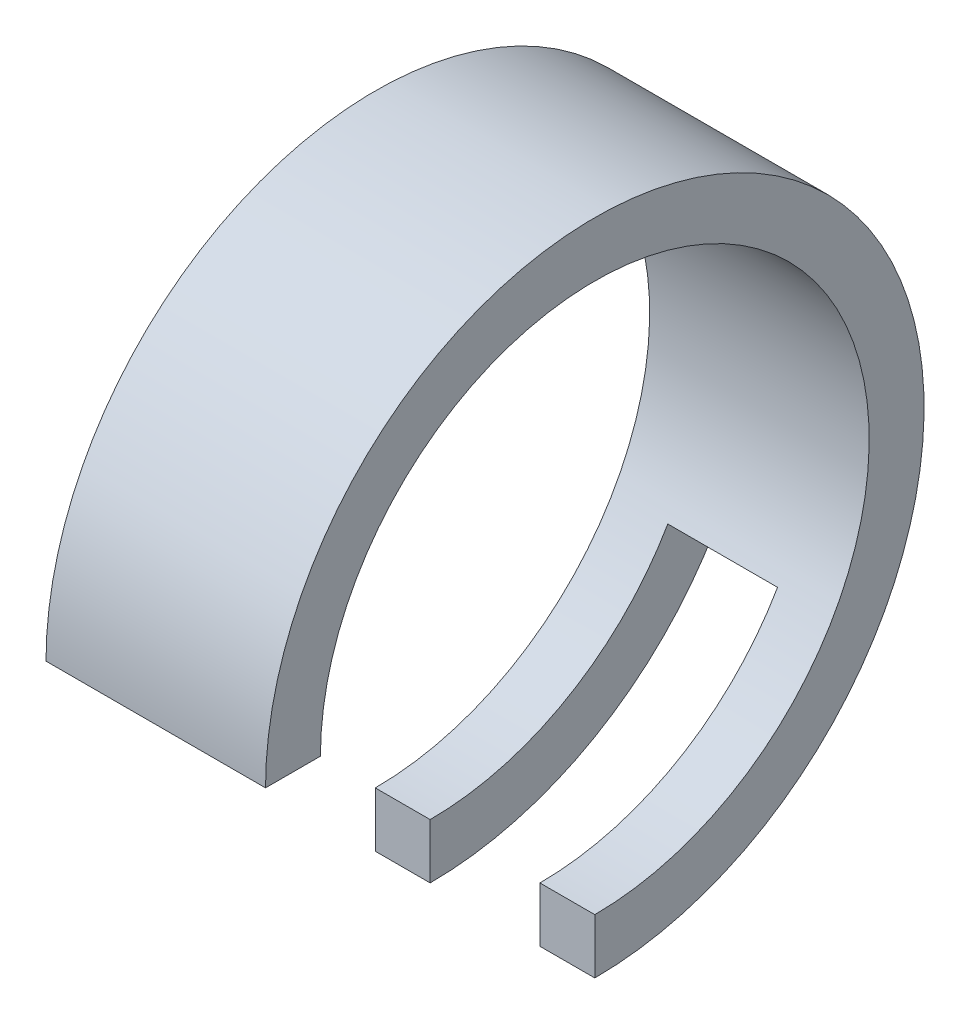
ISO-10303-21;
HEADER;
FILE_DESCRIPTION(('STEP AP214'),'2;1');
FILE_NAME('part.step','',(''),(''),'','','');
FILE_SCHEMA(('AUTOMOTIVE_DESIGN { 1 0 10303 214 1 1 1 1 }'));
ENDSEC;
DATA;
#1=APPLICATION_CONTEXT('core data for automotive mechanical design processes');
#2=APPLICATION_PROTOCOL_DEFINITION('international standard','automotive_design',2000,#1);
#3=PRODUCT_CONTEXT('',#1,'mechanical');
#4=PRODUCT('Part','Part','',(#3));
#5=PRODUCT_RELATED_PRODUCT_CATEGORY('part','',(#4));
#6=PRODUCT_DEFINITION_FORMATION('','',#4);
#7=PRODUCT_DEFINITION_CONTEXT('part definition',#1,'design');
#8=PRODUCT_DEFINITION('design','',#6,#7);
#9=PRODUCT_DEFINITION_SHAPE('','',#8);
#10=(LENGTH_UNIT() NAMED_UNIT(*) SI_UNIT(.MILLI.,.METRE.));
#11=(NAMED_UNIT(*) PLANE_ANGLE_UNIT() SI_UNIT($,.RADIAN.));
#12=(NAMED_UNIT(*) SI_UNIT($,.STERADIAN.) SOLID_ANGLE_UNIT());
#13=UNCERTAINTY_MEASURE_WITH_UNIT(LENGTH_MEASURE(1.E-05),#10,'distance_accuracy_value','');
#14=(GEOMETRIC_REPRESENTATION_CONTEXT(3) GLOBAL_UNCERTAINTY_ASSIGNED_CONTEXT((#13)) GLOBAL_UNIT_ASSIGNED_CONTEXT((#10,
#11,#12)) REPRESENTATION_CONTEXT('',''));
#15=CARTESIAN_POINT('',(0.,0.,0.));
#16=DIRECTION('',(0.,0.,1.));
#17=DIRECTION('',(1.,0.,0.));
#18=AXIS2_PLACEMENT_3D('',#15,#16,#17);
#19=CARTESIAN_POINT('',(-365.597578267393,25.,0.));
#20=DIRECTION('',(-1.,0.,0.));
#21=DIRECTION('',(0.,0.,1.));
#22=AXIS2_PLACEMENT_3D('',#19,#20,#21);
#23=CYLINDRICAL_SURFACE('',#22,25.);
#24=DIRECTION('',(-1.,0.,0.));
#25=VECTOR('',#24,1.);
#26=CARTESIAN_POINT('',(0.,12.5,-21.6506350946109));
#27=LINE('',#26,#25);
#28=CARTESIAN_POINT('',(15.,12.5,-21.6506350946109));
#29=VERTEX_POINT('',#28);
#30=CARTESIAN_POINT('',(4.99999999999999,12.5,-21.6506350946109));
#31=VERTEX_POINT('',#30);
#32=EDGE_CURVE('E123',#29,#31,#27,.T.);
#33=ORIENTED_EDGE('',*,*,#32,.F.);
#34=CARTESIAN_POINT('',(15.,25.,0.));
#35=DIRECTION('',(-1.,0.,0.));
#36=DIRECTION('',(0.,0.,1.));
#37=AXIS2_PLACEMENT_3D('',#34,#35,#36);
#38=CIRCLE('',#37,25.);
#39=CARTESIAN_POINT('',(15.,0.,0.));
#40=VERTEX_POINT('',#39);
#41=EDGE_CURVE('E109',#29,#40,#38,.T.);
#42=ORIENTED_EDGE('',*,*,#41,.T.);
#43=DIRECTION('',(-1.,0.,0.));
#44=VECTOR('',#43,1.);
#45=CARTESIAN_POINT('',(0.,0.,0.));
#46=LINE('',#45,#44);
#47=CARTESIAN_POINT('',(20.,0.,0.));
#48=VERTEX_POINT('',#47);
#49=EDGE_CURVE('E121',#48,#40,#46,.T.);
#50=ORIENTED_EDGE('',*,*,#49,.F.);
#51=CARTESIAN_POINT('',(20.,25.,0.));
#52=DIRECTION('',(-1.,0.,0.));
#53=DIRECTION('',(0.,0.,1.));
#54=AXIS2_PLACEMENT_3D('',#51,#52,#53);
#55=CIRCLE('',#54,25.);
#56=CARTESIAN_POINT('',(20.,24.9999999999997,25.));
#57=VERTEX_POINT('',#56);
#58=EDGE_CURVE('E48',#57,#48,#55,.T.);
#59=ORIENTED_EDGE('',*,*,#58,.F.);
#60=DIRECTION('',(-1.,0.,0.));
#61=VECTOR('',#60,1.);
#62=CARTESIAN_POINT('',(0.,24.9999999999997,25.));
#63=LINE('',#62,#61);
#64=CARTESIAN_POINT('',(0.,24.9999999999997,25.));
#65=VERTEX_POINT('',#64);
#66=EDGE_CURVE('E144',#57,#65,#63,.T.);
#67=ORIENTED_EDGE('',*,*,#66,.T.);
#68=CARTESIAN_POINT('',(0.,25.,0.));
#69=DIRECTION('',(-1.,0.,0.));
#70=DIRECTION('',(0.,0.,1.));
#71=AXIS2_PLACEMENT_3D('',#68,#69,#70);
#72=CIRCLE('',#71,25.);
#73=CARTESIAN_POINT('',(0.,0.,0.));
#74=VERTEX_POINT('',#73);
#75=EDGE_CURVE('E151',#65,#74,#72,.T.);
#76=ORIENTED_EDGE('',*,*,#75,.T.);
#77=CARTESIAN_POINT('',(4.99999999999999,0.,0.));
#78=VERTEX_POINT('',#77);
#79=EDGE_CURVE('E132',#78,#74,#46,.T.);
#80=ORIENTED_EDGE('',*,*,#79,.F.);
#81=CARTESIAN_POINT('',(5.,25.,0.));
#82=DIRECTION('',(-1.,0.,0.));
#83=DIRECTION('',(0.,0.,1.));
#84=AXIS2_PLACEMENT_3D('',#81,#82,#83);
#85=CIRCLE('',#84,25.);
#86=EDGE_CURVE('E125',#31,#78,#85,.T.);
#87=ORIENTED_EDGE('',*,*,#86,.F.);
#88=EDGE_LOOP('',(#33,#42,#50,#59,#67,#76,#80,#87));
#89=FACE_BOUND('',#88,.T.);
#90=ADVANCED_FACE('F40',(#89),#23,.F.);
#91=CARTESIAN_POINT('',(0.,0.,0.));
#92=DIRECTION('',(0.,0.,1.));
#93=DIRECTION('',(1.,0.,0.));
#94=AXIS2_PLACEMENT_3D('',#91,#92,#93);
#95=PLANE('',#94);
#96=ORIENTED_EDGE('',*,*,#49,.T.);
#97=DIRECTION('',(0.,-1.,0.));
#98=VECTOR('',#97,1.);
#99=CARTESIAN_POINT('',(15.,0.,0.));
#100=LINE('',#99,#98);
#101=CARTESIAN_POINT('',(15.,-4.99999999999999,0.));
#102=VERTEX_POINT('',#101);
#103=EDGE_CURVE('E106',#40,#102,#100,.T.);
#104=ORIENTED_EDGE('',*,*,#103,.T.);
#105=DIRECTION('',(1.,0.,0.));
#106=VECTOR('',#105,1.);
#107=CARTESIAN_POINT('',(0.,-4.99999999999999,0.));
#108=LINE('',#107,#106);
#109=CARTESIAN_POINT('',(20.,-4.99999999999999,0.));
#110=VERTEX_POINT('',#109);
#111=EDGE_CURVE('E124',#102,#110,#108,.T.);
#112=ORIENTED_EDGE('',*,*,#111,.T.);
#113=DIRECTION('',(0.,1.,0.));
#114=VECTOR('',#113,1.);
#115=CARTESIAN_POINT('',(20.,0.,0.));
#116=LINE('',#115,#114);
#117=EDGE_CURVE('E130',#110,#48,#116,.T.);
#118=ORIENTED_EDGE('',*,*,#117,.T.);
#119=EDGE_LOOP('',(#96,#104,#112,#118));
#120=FACE_BOUND('',#119,.T.);
#121=ADVANCED_FACE('F128',(#120),#95,.T.);
#122=CARTESIAN_POINT('',(-365.597578267393,25.,0.));
#123=DIRECTION('',(-1.,0.,0.));
#124=DIRECTION('',(0.,0.,1.));
#125=AXIS2_PLACEMENT_3D('',#122,#123,#124);
#126=CYLINDRICAL_SURFACE('',#125,29.9999999999999);
#127=ORIENTED_EDGE('',*,*,#111,.F.);
#128=CARTESIAN_POINT('',(15.,25.,0.));
#129=DIRECTION('',(-1.,0.,0.));
#130=DIRECTION('',(0.,0.,1.));
#131=AXIS2_PLACEMENT_3D('',#128,#129,#130);
#132=CIRCLE('',#131,29.9999999999999);
#133=CARTESIAN_POINT('',(15.,10.,-25.9807621135331));
#134=VERTEX_POINT('',#133);
#135=EDGE_CURVE('E112',#134,#102,#132,.T.);
#136=ORIENTED_EDGE('',*,*,#135,.F.);
#137=DIRECTION('',(1.,0.,0.));
#138=VECTOR('',#137,1.);
#139=CARTESIAN_POINT('',(0.,10.,-25.9807621135331));
#140=LINE('',#139,#138);
#141=CARTESIAN_POINT('',(4.99999999999995,10.,-25.9807621135331));
#142=VERTEX_POINT('',#141);
#143=EDGE_CURVE('E315',#142,#134,#140,.T.);
#144=ORIENTED_EDGE('',*,*,#143,.F.);
#145=CARTESIAN_POINT('',(5.,25.,0.));
#146=DIRECTION('',(-1.,0.,0.));
#147=DIRECTION('',(0.,0.,1.));
#148=AXIS2_PLACEMENT_3D('',#145,#146,#147);
#149=CIRCLE('',#148,29.9999999999999);
#150=CARTESIAN_POINT('',(4.99999999999999,-4.99999999999999,0.));
#151=VERTEX_POINT('',#150);
#152=EDGE_CURVE('E169',#142,#151,#149,.T.);
#153=ORIENTED_EDGE('',*,*,#152,.T.);
#154=CARTESIAN_POINT('',(0.,-4.99999999999999,0.));
#155=VERTEX_POINT('',#154);
#156=EDGE_CURVE('E167',#155,#151,#108,.T.);
#157=ORIENTED_EDGE('',*,*,#156,.F.);
#158=CARTESIAN_POINT('',(0.,25.,0.));
#159=DIRECTION('',(-1.,0.,0.));
#160=DIRECTION('',(0.,0.,1.));
#161=AXIS2_PLACEMENT_3D('',#158,#159,#160);
#162=CIRCLE('',#161,29.9999999999999);
#163=CARTESIAN_POINT('',(0.,24.9999999999996,29.9999999999999));
#164=VERTEX_POINT('',#163);
#165=EDGE_CURVE('E63',#164,#155,#162,.T.);
#166=ORIENTED_EDGE('',*,*,#165,.F.);
#167=DIRECTION('',(1.,0.,0.));
#168=VECTOR('',#167,1.);
#169=CARTESIAN_POINT('',(0.,24.9999999999996,29.9999999999999));
#170=LINE('',#169,#168);
#171=CARTESIAN_POINT('',(20.,24.9999999999996,29.9999999999999));
#172=VERTEX_POINT('',#171);
#173=EDGE_CURVE('E135',#164,#172,#170,.T.);
#174=ORIENTED_EDGE('',*,*,#173,.T.);
#175=CARTESIAN_POINT('',(20.,25.,0.));
#176=DIRECTION('',(-1.,0.,0.));
#177=DIRECTION('',(0.,0.,1.));
#178=AXIS2_PLACEMENT_3D('',#175,#176,#177);
#179=CIRCLE('',#178,29.9999999999999);
#180=EDGE_CURVE('E12',#172,#110,#179,.T.);
#181=ORIENTED_EDGE('',*,*,#180,.T.);
#182=EDGE_LOOP('',(#127,#136,#144,#153,#157,#166,#174,#181));
#183=FACE_BOUND('',#182,.T.);
#184=ADVANCED_FACE('F174',(#183),#126,.T.);
#185=DIRECTION('',(0.,-1.,0.));
#186=VECTOR('',#185,1.);
#187=CARTESIAN_POINT('',(4.99999999999999,0.,0.));
#188=LINE('',#187,#186);
#189=EDGE_CURVE('E116',#78,#151,#188,.T.);
#190=ORIENTED_EDGE('',*,*,#189,.F.);
#191=ORIENTED_EDGE('',*,*,#79,.T.);
#192=DIRECTION('',(0.,-1.,0.));
#193=VECTOR('',#192,1.);
#194=CARTESIAN_POINT('',(0.,0.,0.));
#195=LINE('',#194,#193);
#196=EDGE_CURVE('E131',#74,#155,#195,.T.);
#197=ORIENTED_EDGE('',*,*,#196,.T.);
#198=ORIENTED_EDGE('',*,*,#156,.T.);
#199=EDGE_LOOP('',(#190,#191,#197,#198));
#200=FACE_BOUND('',#199,.T.);
#201=ADVANCED_FACE('F166',(#200),#95,.T.);
#202=CARTESIAN_POINT('',(20.,24.9999999999997,24.9999999999999));
#203=DIRECTION('',(1.,0.,0.));
#204=DIRECTION('',(0.,0.,-1.));
#205=AXIS2_PLACEMENT_3D('',#202,#203,#204);
#206=PLANE('',#205);
#207=ORIENTED_EDGE('',*,*,#58,.T.);
#208=ORIENTED_EDGE('',*,*,#117,.F.);
#209=ORIENTED_EDGE('',*,*,#180,.F.);
#210=DIRECTION('',(0.,0.,-1.));
#211=VECTOR('',#210,1.);
#212=CARTESIAN_POINT('',(20.,24.9999999999997,24.9999999999999));
#213=LINE('',#212,#211);
#214=EDGE_CURVE('E141',#172,#57,#213,.T.);
#215=ORIENTED_EDGE('',*,*,#214,.T.);
#216=EDGE_LOOP('',(#207,#208,#209,#215));
#217=FACE_BOUND('',#216,.T.);
#218=ADVANCED_FACE('F42',(#217),#206,.T.);
#219=CARTESIAN_POINT('',(0.,24.9999999999997,25.));
#220=DIRECTION('',(-1.,0.,0.));
#221=DIRECTION('',(0.,0.,1.));
#222=AXIS2_PLACEMENT_3D('',#219,#220,#221);
#223=PLANE('',#222);
#224=DIRECTION('',(0.,0.,1.));
#225=VECTOR('',#224,1.);
#226=CARTESIAN_POINT('',(0.,24.9999999999997,25.));
#227=LINE('',#226,#225);
#228=EDGE_CURVE('E147',#65,#164,#227,.T.);
#229=ORIENTED_EDGE('',*,*,#228,.T.);
#230=ORIENTED_EDGE('',*,*,#165,.T.);
#231=ORIENTED_EDGE('',*,*,#196,.F.);
#232=ORIENTED_EDGE('',*,*,#75,.F.);
#233=EDGE_LOOP('',(#229,#230,#231,#232));
#234=FACE_BOUND('',#233,.T.);
#235=ADVANCED_FACE('F162',(#234),#223,.T.);
#236=CARTESIAN_POINT('',(0.,24.9999999999997,25.));
#237=DIRECTION('',(0.,1.,0.));
#238=DIRECTION('',(1.,0.,0.));
#239=AXIS2_PLACEMENT_3D('',#236,#237,#238);
#240=PLANE('',#239);
#241=ORIENTED_EDGE('',*,*,#173,.F.);
#242=ORIENTED_EDGE('',*,*,#228,.F.);
#243=ORIENTED_EDGE('',*,*,#66,.F.);
#244=ORIENTED_EDGE('',*,*,#214,.F.);
#245=EDGE_LOOP('',(#241,#242,#243,#244));
#246=FACE_BOUND('',#245,.T.);
#247=ADVANCED_FACE('F160',(#246),#240,.F.);
#248=CARTESIAN_POINT('',(15.,12.5,-21.6506350946109));
#249=DIRECTION('',(-1.,0.,0.));
#250=DIRECTION('',(0.,0.,1.));
#251=AXIS2_PLACEMENT_3D('',#248,#249,#250);
#252=PLANE('',#251);
#253=ORIENTED_EDGE('',*,*,#41,.F.);
#254=DIRECTION('',(0.,-0.499999999999999,-0.866025403784439));
#255=VECTOR('',#254,1.);
#256=CARTESIAN_POINT('',(15.,12.5,-21.6506350946109));
#257=LINE('',#256,#255);
#258=EDGE_CURVE('E313',#29,#134,#257,.T.);
#259=ORIENTED_EDGE('',*,*,#258,.T.);
#260=ORIENTED_EDGE('',*,*,#135,.T.);
#261=ORIENTED_EDGE('',*,*,#103,.F.);
#262=EDGE_LOOP('',(#253,#259,#260,#261));
#263=FACE_BOUND('',#262,.T.);
#264=ADVANCED_FACE('F108',(#263),#252,.T.);
#265=CARTESIAN_POINT('',(4.99999999999999,12.5,-21.6506350946109));
#266=DIRECTION('',(-1.,0.,0.));
#267=DIRECTION('',(0.,0.,1.));
#268=AXIS2_PLACEMENT_3D('',#265,#266,#267);
#269=PLANE('',#268);
#270=ORIENTED_EDGE('',*,*,#152,.F.);
#271=DIRECTION('',(0.,-0.499999999999999,-0.866025403784439));
#272=VECTOR('',#271,1.);
#273=CARTESIAN_POINT('',(4.99999999999999,12.5,-21.6506350946109));
#274=LINE('',#273,#272);
#275=EDGE_CURVE('E55',#31,#142,#274,.T.);
#276=ORIENTED_EDGE('',*,*,#275,.F.);
#277=ORIENTED_EDGE('',*,*,#86,.T.);
#278=ORIENTED_EDGE('',*,*,#189,.T.);
#279=EDGE_LOOP('',(#270,#276,#277,#278));
#280=FACE_BOUND('',#279,.T.);
#281=ADVANCED_FACE('F212',(#280),#269,.F.);
#282=CARTESIAN_POINT('',(0.,12.5,-21.6506350946109));
#283=DIRECTION('',(0.,-0.866025403784439,0.499999999999999));
#284=DIRECTION('',(1.,0.,0.));
#285=AXIS2_PLACEMENT_3D('',#282,#283,#284);
#286=PLANE('',#285);
#287=ORIENTED_EDGE('',*,*,#258,.F.);
#288=ORIENTED_EDGE('',*,*,#32,.T.);
#289=ORIENTED_EDGE('',*,*,#275,.T.);
#290=ORIENTED_EDGE('',*,*,#143,.T.);
#291=EDGE_LOOP('',(#287,#288,#289,#290));
#292=FACE_BOUND('',#291,.T.);
#293=ADVANCED_FACE('F223',(#292),#286,.T.);
#294=CLOSED_SHELL('',(#90,#121,#184,#201,#218,#235,#247,#264,#281,#293));
#295=MANIFOLD_SOLID_BREP('B2',#294);
#296=ADVANCED_BREP_SHAPE_REPRESENTATION('',(#18,#295),#14);
#297=SHAPE_DEFINITION_REPRESENTATION(#9,#296);
ENDSEC;
END-ISO-10303-21;
